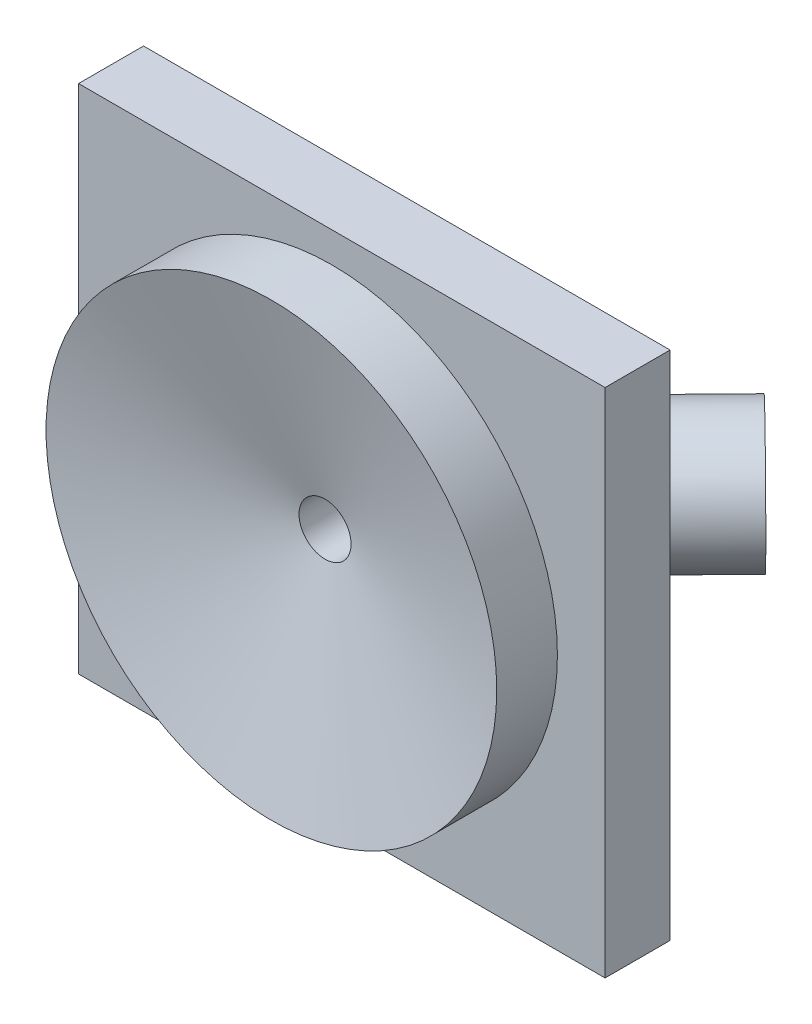
ISO-10303-21;
HEADER;
FILE_DESCRIPTION(('STEP AP214'),'2;1');
FILE_NAME('part.step','',(''),(''),'','','');
FILE_SCHEMA(('AUTOMOTIVE_DESIGN { 1 0 10303 214 1 1 1 1 }'));
ENDSEC;
DATA;
#1=APPLICATION_CONTEXT('core data for automotive mechanical design processes');
#2=APPLICATION_PROTOCOL_DEFINITION('international standard','automotive_design',2000,#1);
#3=PRODUCT_CONTEXT('',#1,'mechanical');
#4=PRODUCT('Part','Part','',(#3));
#5=PRODUCT_RELATED_PRODUCT_CATEGORY('part','',(#4));
#6=PRODUCT_DEFINITION_FORMATION('','',#4);
#7=PRODUCT_DEFINITION_CONTEXT('part definition',#1,'design');
#8=PRODUCT_DEFINITION('design','',#6,#7);
#9=PRODUCT_DEFINITION_SHAPE('','',#8);
#10=(LENGTH_UNIT() NAMED_UNIT(*) SI_UNIT(.MILLI.,.METRE.));
#11=(NAMED_UNIT(*) PLANE_ANGLE_UNIT() SI_UNIT($,.RADIAN.));
#12=(NAMED_UNIT(*) SI_UNIT($,.STERADIAN.) SOLID_ANGLE_UNIT());
#13=UNCERTAINTY_MEASURE_WITH_UNIT(LENGTH_MEASURE(1.E-05),#10,'distance_accuracy_value','');
#14=(GEOMETRIC_REPRESENTATION_CONTEXT(3) GLOBAL_UNCERTAINTY_ASSIGNED_CONTEXT((#13)) GLOBAL_UNIT_ASSIGNED_CONTEXT((#10,
#11,#12)) REPRESENTATION_CONTEXT('',''));
#15=CARTESIAN_POINT('',(0.,0.,0.));
#16=DIRECTION('',(0.,0.,1.));
#17=DIRECTION('',(1.,0.,0.));
#18=AXIS2_PLACEMENT_3D('',#15,#16,#17);
#19=CARTESIAN_POINT('',(27.312795089858,0.,-3.14804184683463));
#20=DIRECTION('',(0.,0.,1.));
#21=DIRECTION('',(1.,0.,0.));
#22=AXIS2_PLACEMENT_3D('',#19,#20,#21);
#23=CONICAL_SURFACE('',#22,0.,1.30780159511398);
#24=CARTESIAN_POINT('',(27.312795089858,0.,-1.74804184683463));
#25=DIRECTION('',(0.,0.,1.));
#26=DIRECTION('',(1.,0.,0.));
#27=AXIS2_PLACEMENT_3D('',#24,#25,#26);
#28=CIRCLE('',#27,5.2);
#29=CARTESIAN_POINT('',(32.512795089858,0.,-1.74804184683463));
#30=VERTEX_POINT('',#29);
#31=EDGE_CURVE('E149',#30,#30,#28,.T.);
#32=CARTESIAN_POINT('',(27.312795089858,0.,-2.98650338529617));
#33=DIRECTION('',(0.,0.,1.));
#34=DIRECTION('',(1.,0.,0.));
#35=AXIS2_PLACEMENT_3D('',#32,#33,#34);
#36=CIRCLE('',#35,0.6);
#37=CARTESIAN_POINT('',(27.912795089858,0.,-2.98650338529617));
#38=VERTEX_POINT('',#37);
#39=EDGE_CURVE('E157',#38,#38,#36,.F.);
#40=CARTESIAN_POINT('',(32.512795089858,0.,-1.74804184683463));
#41=CARTESIAN_POINT('',(32.4648784231913,0.,-1.76094248786027));
#42=CARTESIAN_POINT('',(32.4169617565246,0.,-1.77384312888591));
#43=CARTESIAN_POINT('',(32.3211284231913,0.,-1.7996444109372));
#44=CARTESIAN_POINT('',(32.2732117565246,0.,-1.81254505196284));
#45=CARTESIAN_POINT('',(32.1773784231913,0.,-1.83834633401412));
#46=CARTESIAN_POINT('',(32.1294617565246,0.,-1.85124697503976));
#47=CARTESIAN_POINT('',(32.0336284231913,0.,-1.87704825709104));
#48=CARTESIAN_POINT('',(31.9857117565246,0.,-1.88994889811668));
#49=CARTESIAN_POINT('',(31.8898784231913,0.,-1.91575018016797));
#50=CARTESIAN_POINT('',(31.8419617565246,0.,-1.92865082119361));
#51=CARTESIAN_POINT('',(31.7461284231913,0.,-1.95445210324489));
#52=CARTESIAN_POINT('',(31.6982117565246,0.,-1.96735274427053));
#53=CARTESIAN_POINT('',(31.6023784231913,0.,-1.99315402632181));
#54=CARTESIAN_POINT('',(31.5544617565246,0.,-2.00605466734745));
#55=CARTESIAN_POINT('',(31.4586284231913,0.,-2.03185594939873));
#56=CARTESIAN_POINT('',(31.4107117565246,0.,-2.04475659042438));
#57=CARTESIAN_POINT('',(31.3148784231913,0.,-2.07055787247566));
#58=CARTESIAN_POINT('',(31.2669617565246,0.,-2.0834585135013));
#59=CARTESIAN_POINT('',(31.1711284231913,0.,-2.10925979555258));
#60=CARTESIAN_POINT('',(31.1232117565246,0.,-2.12216043657822));
#61=CARTESIAN_POINT('',(31.0273784231913,0.,-2.1479617186295));
#62=CARTESIAN_POINT('',(30.9794617565246,0.,-2.16086235965515));
#63=CARTESIAN_POINT('',(30.8836284231913,0.,-2.18666364170643));
#64=CARTESIAN_POINT('',(30.8357117565246,0.,-2.19956428273207));
#65=CARTESIAN_POINT('',(30.7398784231913,0.,-2.22536556478335));
#66=CARTESIAN_POINT('',(30.6919617565246,0.,-2.23826620580899));
#67=CARTESIAN_POINT('',(30.5961284231913,0.,-2.26406748786027));
#68=CARTESIAN_POINT('',(30.5482117565246,0.,-2.27696812888591));
#69=CARTESIAN_POINT('',(30.4523784231913,0.,-2.3027694109372));
#70=CARTESIAN_POINT('',(30.4044617565246,0.,-2.31567005196284));
#71=CARTESIAN_POINT('',(30.3086284231913,0.,-2.34147133401412));
#72=CARTESIAN_POINT('',(30.2607117565246,0.,-2.35437197503976));
#73=CARTESIAN_POINT('',(30.1648784231913,0.,-2.38017325709104));
#74=CARTESIAN_POINT('',(30.1169617565246,0.,-2.39307389811668));
#75=CARTESIAN_POINT('',(30.0211284231913,0.,-2.41887518016797));
#76=CARTESIAN_POINT('',(29.9732117565246,0.,-2.43177582119361));
#77=CARTESIAN_POINT('',(29.8773784231913,0.,-2.45757710324489));
#78=CARTESIAN_POINT('',(29.8294617565246,0.,-2.47047774427053));
#79=CARTESIAN_POINT('',(29.7336284231913,0.,-2.49627902632181));
#80=CARTESIAN_POINT('',(29.6857117565246,0.,-2.50917966734745));
#81=CARTESIAN_POINT('',(29.5898784231913,0.,-2.53498094939873));
#82=CARTESIAN_POINT('',(29.5419617565246,0.,-2.54788159042438));
#83=CARTESIAN_POINT('',(29.4461284231913,0.,-2.57368287247566));
#84=CARTESIAN_POINT('',(29.3982117565246,0.,-2.5865835135013));
#85=CARTESIAN_POINT('',(29.3023784231913,0.,-2.61238479555258));
#86=CARTESIAN_POINT('',(29.2544617565246,0.,-2.62528543657822));
#87=CARTESIAN_POINT('',(29.1586284231913,0.,-2.6510867186295));
#88=CARTESIAN_POINT('',(29.1107117565246,0.,-2.66398735965515));
#89=CARTESIAN_POINT('',(29.0148784231913,0.,-2.68978864170643));
#90=CARTESIAN_POINT('',(28.9669617565246,0.,-2.70268928273207));
#91=CARTESIAN_POINT('',(28.8711284231913,0.,-2.72849056478335));
#92=CARTESIAN_POINT('',(28.8232117565246,0.,-2.74139120580899));
#93=CARTESIAN_POINT('',(28.7273784231913,0.,-2.76719248786027));
#94=CARTESIAN_POINT('',(28.6794617565246,0.,-2.78009312888591));
#95=CARTESIAN_POINT('',(28.5836284231913,0.,-2.8058944109372));
#96=CARTESIAN_POINT('',(28.5357117565246,0.,-2.81879505196284));
#97=CARTESIAN_POINT('',(28.4398784231913,0.,-2.84459633401412));
#98=CARTESIAN_POINT('',(28.3919617565246,0.,-2.85749697503976));
#99=CARTESIAN_POINT('',(28.2961284231913,0.,-2.88329825709104));
#100=CARTESIAN_POINT('',(28.2482117565246,0.,-2.89619889811668));
#101=CARTESIAN_POINT('',(28.1523784231913,0.,-2.92200018016797));
#102=CARTESIAN_POINT('',(28.1044617565246,0.,-2.93490082119361));
#103=CARTESIAN_POINT('',(28.0086284231913,0.,-2.96070210324489));
#104=CARTESIAN_POINT('',(27.9607117565246,0.,-2.97360274427053));
#105=CARTESIAN_POINT('',(27.912795089858,0.,-2.98650338529617));
#106=B_SPLINE_CURVE_WITH_KNOTS('',3,(#40,#41,#42,#43,#44,#45,#46,#47,#48,#49,#50,#51,#52,#53,
#54,#55,#56,#57,#58,#59,#60,#61,#62,#63,#64,#65,#66,#67,#68,#69,#70,#71,#72,#73,#74,#75,#76,#77,
#78,#79,#80,#81,#82,#83,#84,#85,#86,#87,#88,#89,#90,#91,#92,#93,#94,#95,#96,#97,#98,#99,#100,
#101,#102,#103,#104,#105),.UNSPECIFIED.,.F.,.F.,(4,2,2,2,2,2,2,2,2,2,2,2,2,2,2,2,2,2,2,2,2,2,2,
2,2,2,2,2,2,2,2,2,4),(0.,0.148868738658764,0.297737477317529,0.4466062159763,0.595474954635065,
0.744343693293829,0.893212431952593,1.04208117061136,1.19094990927013,1.3398186479289,
1.48868738658766,1.63755612524643,1.78642486390519,1.93529360256396,2.08416234122273,
2.23303107988149,2.38189981854026,2.53076855719903,2.67963729585779,2.82850603451656,
2.97737477317533,3.12624351183409,3.27511225049286,3.42398098915163,3.57284972781039,
3.72171846646916,3.87058720512792,4.01945594378669,4.16832468244546,4.31719342110422,
4.46606215976299,4.61493089842176,4.76379963708052),.UNSPECIFIED.);
#107=EDGE_CURVE('BSEAM39',#30,#38,#106,.T.);
#108=ORIENTED_EDGE('',*,*,#31,.T.);
#109=ORIENTED_EDGE('',*,*,#39,.T.);
#110=ORIENTED_EDGE('',*,*,#107,.T.);
#111=ORIENTED_EDGE('',*,*,#107,.F.);
#112=EDGE_LOOP('',(#108,#110,#109,#111));
#113=FACE_BOUND('',#112,.T.);
#114=ADVANCED_FACE('F39',(#113),#23,.F.);
#115=CARTESIAN_POINT('',(27.312795089858,0.,-4.64804184683463));
#116=DIRECTION('',(0.,0.,-1.));
#117=DIRECTION('',(-1.,0.,0.));
#118=AXIS2_PLACEMENT_3D('',#115,#116,#117);
#119=PLANE('',#118);
#120=CARTESIAN_POINT('',(27.2730304625921,0.,-4.64804184683463));
#121=DIRECTION('',(0.,0.,-1.));
#122=DIRECTION('',(-1.,0.,0.));
#123=AXIS2_PLACEMENT_3D('',#120,#121,#122);
#124=ELLIPSE('',#123,2.06152825217142,1.475);
#125=CARTESIAN_POINT('',(27.412795089858,-1.47160626527615,-4.64804184683463));
#126=VERTEX_POINT('',#125);
#127=CARTESIAN_POINT('',(27.412795089858,1.47160626527615,-4.64804184683463));
#128=VERTEX_POINT('',#127);
#129=EDGE_CURVE('E49',#126,#128,#124,.F.);
#130=ORIENTED_EDGE('',*,*,#129,.T.);
#131=CARTESIAN_POINT('',(27.312795089858,0.,-4.64804184683463));
#132=DIRECTION('',(0.,0.,-1.));
#133=DIRECTION('',(-1.,0.,0.));
#134=AXIS2_PLACEMENT_3D('',#131,#132,#133);
#135=CIRCLE('',#134,1.475);
#136=EDGE_CURVE('E11',#128,#126,#135,.F.);
#137=ORIENTED_EDGE('',*,*,#136,.T.);
#138=EDGE_LOOP('',(#130,#137));
#139=FACE_BOUND('',#138,.T.);
#140=DIRECTION('',(0.,1.,0.));
#141=VECTOR('',#140,1.);
#142=CARTESIAN_POINT('',(21.462795089858,-5.9,-4.64804184683463));
#143=LINE('',#142,#141);
#144=CARTESIAN_POINT('',(21.462795089858,-5.9,-4.64804184683463));
#145=VERTEX_POINT('',#144);
#146=CARTESIAN_POINT('',(21.462795089858,5.9,-4.64804184683463));
#147=VERTEX_POINT('',#146);
#148=EDGE_CURVE('E127',#145,#147,#143,.T.);
#149=ORIENTED_EDGE('',*,*,#148,.T.);
#150=DIRECTION('',(1.,0.,0.));
#151=VECTOR('',#150,1.);
#152=CARTESIAN_POINT('',(21.462795089858,5.9,-4.64804184683463));
#153=LINE('',#152,#151);
#154=CARTESIAN_POINT('',(33.612795089858,5.9,-4.64804184683463));
#155=VERTEX_POINT('',#154);
#156=EDGE_CURVE('E91',#147,#155,#153,.T.);
#157=ORIENTED_EDGE('',*,*,#156,.T.);
#158=DIRECTION('',(0.,-1.,0.));
#159=VECTOR('',#158,1.);
#160=CARTESIAN_POINT('',(33.612795089858,5.9,-4.64804184683463));
#161=LINE('',#160,#159);
#162=CARTESIAN_POINT('',(33.612795089858,-5.9,-4.64804184683463));
#163=VERTEX_POINT('',#162);
#164=EDGE_CURVE('E118',#155,#163,#161,.T.);
#165=ORIENTED_EDGE('',*,*,#164,.T.);
#166=DIRECTION('',(-1.,0.,0.));
#167=VECTOR('',#166,1.);
#168=CARTESIAN_POINT('',(33.612795089858,-5.9,-4.64804184683463));
#169=LINE('',#168,#167);
#170=EDGE_CURVE('E114',#163,#145,#169,.T.);
#171=ORIENTED_EDGE('',*,*,#170,.T.);
#172=EDGE_LOOP('',(#149,#157,#165,#171));
#173=FACE_BOUND('',#172,.T.);
#174=ADVANCED_FACE('F41',(#139,#173),#119,.T.);
#175=CARTESIAN_POINT('',(31.4838869151828,0.,-8.96054497290303));
#176=DIRECTION('',(0.698624389490976,0.,-0.715488617944661));
#177=DIRECTION('',(-0.715488617944661,0.,-0.698624389490976));
#178=AXIS2_PLACEMENT_3D('',#175,#176,#177);
#179=PLANE('',#178);
#180=CARTESIAN_POINT('',(31.5344781103892,0.,-8.9111462236032));
#181=DIRECTION('',(0.698624389490976,0.,-0.715488617944661));
#182=DIRECTION('',(0.715488617944661,0.,0.698624389490976));
#183=AXIS2_PLACEMENT_3D('',#180,#181,#182);
#184=ELLIPSE('',#183,0.6000426648805,0.6);
#185=CARTESIAN_POINT('',(31.9638018073924,0.,-8.49194178318252));
#186=VERTEX_POINT('',#185);
#187=EDGE_CURVE('E43',#186,#186,#184,.F.);
#188=ORIENTED_EDGE('',*,*,#187,.T.);
#189=EDGE_LOOP('',(#188));
#190=FACE_BOUND('',#189,.T.);
#191=CARTESIAN_POINT('',(31.4838869151828,0.,-8.96054497290303));
#192=DIRECTION('',(0.698624389490976,0.,-0.715488617944661));
#193=DIRECTION('',(-0.715488617944661,0.,-0.698624389490976));
#194=AXIS2_PLACEMENT_3D('',#191,#192,#193);
#195=CIRCLE('',#194,1.475);
#196=CARTESIAN_POINT('',(30.4285412037144,0.,-9.99101594740222));
#197=VERTEX_POINT('',#196);
#198=EDGE_CURVE('E143',#197,#197,#195,.T.);
#199=ORIENTED_EDGE('',*,*,#198,.T.);
#200=EDGE_LOOP('',(#199));
#201=FACE_BOUND('',#200,.T.);
#202=ADVANCED_FACE('F190',(#190,#201),#179,.T.);
#203=CARTESIAN_POINT('',(27.312795089858,0.,-5.45359403886449));
#204=DIRECTION('',(0.,0.,1.));
#205=DIRECTION('',(1.,0.,0.));
#206=AXIS2_PLACEMENT_3D('',#203,#204,#205);
#207=CYLINDRICAL_SURFACE('',#206,1.475);
#208=ORIENTED_EDGE('',*,*,#136,.F.);
#209=CARTESIAN_POINT('',(27.312795089858,0.,-4.68876636008311));
#210=DIRECTION('',(-0.377167987808708,0.,0.926144863923744));
#211=DIRECTION('',(-0.926144863923744,0.,-0.377167987808708));
#212=AXIS2_PLACEMENT_3D('',#209,#210,#211);
#213=ELLIPSE('',#212,1.59262341935467,1.475);
#214=EDGE_CURVE('E56',#128,#126,#213,.T.);
#215=ORIENTED_EDGE('',*,*,#214,.T.);
#216=EDGE_LOOP('',(#208,#215));
#217=FACE_BOUND('',#216,.T.);
#218=ADVANCED_FACE('F196',(#217),#207,.T.);
#219=CARTESIAN_POINT('',(31.4838869151828,0.,-8.96054497290303));
#220=DIRECTION('',(-0.698624389490976,0.,0.715488617944661));
#221=DIRECTION('',(0.715488617944661,0.,0.698624389490976));
#222=AXIS2_PLACEMENT_3D('',#219,#220,#221);
#223=CYLINDRICAL_SURFACE('',#222,1.475);
#224=ORIENTED_EDGE('',*,*,#129,.F.);
#225=ORIENTED_EDGE('',*,*,#214,.F.);
#226=EDGE_LOOP('',(#224,#225));
#227=FACE_BOUND('',#226,.T.);
#228=ORIENTED_EDGE('',*,*,#198,.F.);
#229=EDGE_LOOP('',(#228));
#230=FACE_BOUND('',#229,.T.);
#231=ADVANCED_FACE('F192',(#227,#230),#223,.T.);
#232=CARTESIAN_POINT('',(21.462795089858,-5.9,-3.14804184683463));
#233=DIRECTION('',(-1.,0.,0.));
#234=DIRECTION('',(0.,0.,1.));
#235=AXIS2_PLACEMENT_3D('',#232,#233,#234);
#236=PLANE('',#235);
#237=ORIENTED_EDGE('',*,*,#148,.F.);
#238=DIRECTION('',(0.,0.,-1.));
#239=VECTOR('',#238,1.);
#240=CARTESIAN_POINT('',(21.462795089858,-5.9,-3.14804184683463));
#241=LINE('',#240,#239);
#242=CARTESIAN_POINT('',(21.462795089858,-5.9,-3.14804184683463));
#243=VERTEX_POINT('',#242);
#244=EDGE_CURVE('E112',#243,#145,#241,.T.);
#245=ORIENTED_EDGE('',*,*,#244,.F.);
#246=DIRECTION('',(0.,1.,0.));
#247=VECTOR('',#246,1.);
#248=CARTESIAN_POINT('',(21.462795089858,-5.9,-3.14804184683463));
#249=LINE('',#248,#247);
#250=CARTESIAN_POINT('',(21.462795089858,5.9,-3.14804184683463));
#251=VERTEX_POINT('',#250);
#252=EDGE_CURVE('E105',#243,#251,#249,.T.);
#253=ORIENTED_EDGE('',*,*,#252,.T.);
#254=DIRECTION('',(0.,0.,-1.));
#255=VECTOR('',#254,1.);
#256=CARTESIAN_POINT('',(21.462795089858,5.9,-3.14804184683463));
#257=LINE('',#256,#255);
#258=EDGE_CURVE('E86',#251,#147,#257,.T.);
#259=ORIENTED_EDGE('',*,*,#258,.T.);
#260=EDGE_LOOP('',(#237,#245,#253,#259));
#261=FACE_BOUND('',#260,.T.);
#262=ADVANCED_FACE('F111',(#261),#236,.T.);
#263=CARTESIAN_POINT('',(33.612795089858,-5.9,-3.14804184683463));
#264=DIRECTION('',(0.,-1.,0.));
#265=DIRECTION('',(0.,0.,-1.));
#266=AXIS2_PLACEMENT_3D('',#263,#264,#265);
#267=PLANE('',#266);
#268=ORIENTED_EDGE('',*,*,#170,.F.);
#269=DIRECTION('',(0.,0.,-1.));
#270=VECTOR('',#269,1.);
#271=CARTESIAN_POINT('',(33.612795089858,-5.9,-3.14804184683463));
#272=LINE('',#271,#270);
#273=CARTESIAN_POINT('',(33.612795089858,-5.9,-3.14804184683463));
#274=VERTEX_POINT('',#273);
#275=EDGE_CURVE('E138',#274,#163,#272,.T.);
#276=ORIENTED_EDGE('',*,*,#275,.F.);
#277=DIRECTION('',(-1.,0.,0.));
#278=VECTOR('',#277,1.);
#279=CARTESIAN_POINT('',(33.612795089858,-5.9,-3.14804184683463));
#280=LINE('',#279,#278);
#281=EDGE_CURVE('E98',#274,#243,#280,.T.);
#282=ORIENTED_EDGE('',*,*,#281,.T.);
#283=ORIENTED_EDGE('',*,*,#244,.T.);
#284=EDGE_LOOP('',(#268,#276,#282,#283));
#285=FACE_BOUND('',#284,.T.);
#286=ADVANCED_FACE('F205',(#285),#267,.T.);
#287=CARTESIAN_POINT('',(33.612795089858,5.9,-3.14804184683463));
#288=DIRECTION('',(1.,0.,0.));
#289=DIRECTION('',(0.,0.,-1.));
#290=AXIS2_PLACEMENT_3D('',#287,#288,#289);
#291=PLANE('',#290);
#292=ORIENTED_EDGE('',*,*,#164,.F.);
#293=DIRECTION('',(0.,0.,-1.));
#294=VECTOR('',#293,1.);
#295=CARTESIAN_POINT('',(33.612795089858,5.9,-3.14804184683463));
#296=LINE('',#295,#294);
#297=CARTESIAN_POINT('',(33.612795089858,5.9,-3.14804184683463));
#298=VERTEX_POINT('',#297);
#299=EDGE_CURVE('E97',#298,#155,#296,.T.);
#300=ORIENTED_EDGE('',*,*,#299,.F.);
#301=DIRECTION('',(0.,-1.,0.));
#302=VECTOR('',#301,1.);
#303=CARTESIAN_POINT('',(33.612795089858,5.9,-3.14804184683463));
#304=LINE('',#303,#302);
#305=EDGE_CURVE('E108',#298,#274,#304,.T.);
#306=ORIENTED_EDGE('',*,*,#305,.T.);
#307=ORIENTED_EDGE('',*,*,#275,.T.);
#308=EDGE_LOOP('',(#292,#300,#306,#307));
#309=FACE_BOUND('',#308,.T.);
#310=ADVANCED_FACE('F208',(#309),#291,.T.);
#311=CARTESIAN_POINT('',(21.462795089858,5.9,-3.14804184683463));
#312=DIRECTION('',(0.,1.,0.));
#313=DIRECTION('',(-1.,0.,0.));
#314=AXIS2_PLACEMENT_3D('',#311,#312,#313);
#315=PLANE('',#314);
#316=ORIENTED_EDGE('',*,*,#156,.F.);
#317=ORIENTED_EDGE('',*,*,#258,.F.);
#318=DIRECTION('',(1.,0.,0.));
#319=VECTOR('',#318,1.);
#320=CARTESIAN_POINT('',(21.462795089858,5.9,-3.14804184683463));
#321=LINE('',#320,#319);
#322=EDGE_CURVE('E89',#251,#298,#321,.T.);
#323=ORIENTED_EDGE('',*,*,#322,.T.);
#324=ORIENTED_EDGE('',*,*,#299,.T.);
#325=EDGE_LOOP('',(#316,#317,#323,#324));
#326=FACE_BOUND('',#325,.T.);
#327=ADVANCED_FACE('F88',(#326),#315,.T.);
#328=CARTESIAN_POINT('',(0.,0.,-3.14804184683463));
#329=DIRECTION('',(0.,0.,-1.));
#330=DIRECTION('',(-1.,0.,0.));
#331=AXIS2_PLACEMENT_3D('',#328,#329,#330);
#332=PLANE('',#331);
#333=CARTESIAN_POINT('',(27.312795089858,0.,-3.14804184683463));
#334=DIRECTION('',(0.,0.,-1.));
#335=DIRECTION('',(-1.,0.,0.));
#336=AXIS2_PLACEMENT_3D('',#333,#334,#335);
#337=CIRCLE('',#336,5.2);
#338=CARTESIAN_POINT('',(22.112795089858,0.,-3.14804184683463));
#339=VERTEX_POINT('',#338);
#340=EDGE_CURVE('E137',#339,#339,#337,.F.);
#341=ORIENTED_EDGE('',*,*,#340,.F.);
#342=EDGE_LOOP('',(#341));
#343=FACE_BOUND('',#342,.T.);
#344=ORIENTED_EDGE('',*,*,#252,.F.);
#345=ORIENTED_EDGE('',*,*,#281,.F.);
#346=ORIENTED_EDGE('',*,*,#305,.F.);
#347=ORIENTED_EDGE('',*,*,#322,.F.);
#348=EDGE_LOOP('',(#344,#345,#346,#347));
#349=FACE_BOUND('',#348,.T.);
#350=ADVANCED_FACE('F103',(#343,#349),#332,.F.);
#351=CARTESIAN_POINT('',(27.312795089858,0.,-3.14804184683463));
#352=DIRECTION('',(0.,0.,1.));
#353=DIRECTION('',(1.,0.,0.));
#354=AXIS2_PLACEMENT_3D('',#351,#352,#353);
#355=CYLINDRICAL_SURFACE('',#354,5.2);
#356=ORIENTED_EDGE('',*,*,#31,.F.);
#357=EDGE_LOOP('',(#356));
#358=FACE_BOUND('',#357,.T.);
#359=ORIENTED_EDGE('',*,*,#340,.T.);
#360=EDGE_LOOP('',(#359));
#361=FACE_BOUND('',#360,.T.);
#362=ADVANCED_FACE('F172',(#358,#361),#355,.T.);
#363=CARTESIAN_POINT('',(27.0458459551343,0.,-4.42251406834827));
#364=DIRECTION('',(0.707106781186549,0.,-0.707106781186546));
#365=DIRECTION('',(-0.707106781186546,0.,-0.707106781186549));
#366=AXIS2_PLACEMENT_3D('',#363,#364,#365);
#367=CYLINDRICAL_SURFACE('',#366,0.6);
#368=ORIENTED_EDGE('',*,*,#187,.F.);
#369=EDGE_LOOP('',(#368));
#370=FACE_BOUND('',#369,.T.);
#371=CARTESIAN_POINT('',(27.312795089858,0.,-4.68946320307194));
#372=DIRECTION('',(0.382683432365091,0.,-0.923879532511287));
#373=DIRECTION('',(-0.923879532511287,0.,-0.382683432365091));
#374=AXIS2_PLACEMENT_3D('',#371,#372,#373);
#375=ELLIPSE('',#374,0.649435320175437,0.6);
#376=CARTESIAN_POINT('',(26.712795089858,0.,-4.9379913404958));
#377=VERTEX_POINT('',#376);
#378=EDGE_CURVE('E121',#377,#377,#375,.T.);
#379=ORIENTED_EDGE('',*,*,#378,.F.);
#380=EDGE_LOOP('',(#379));
#381=FACE_BOUND('',#380,.T.);
#382=ADVANCED_FACE('F170',(#370,#381),#367,.F.);
#383=CARTESIAN_POINT('',(27.312795089858,0.,0.));
#384=DIRECTION('',(0.,0.,-1.));
#385=DIRECTION('',(-1.,0.,0.));
#386=AXIS2_PLACEMENT_3D('',#383,#384,#385);
#387=CYLINDRICAL_SURFACE('',#386,0.6);
#388=ORIENTED_EDGE('',*,*,#39,.F.);
#389=EDGE_LOOP('',(#388));
#390=FACE_BOUND('',#389,.T.);
#391=ORIENTED_EDGE('',*,*,#378,.T.);
#392=EDGE_LOOP('',(#391));
#393=FACE_BOUND('',#392,.T.);
#394=ADVANCED_FACE('F168',(#390,#393),#387,.F.);
#395=CLOSED_SHELL('',(#114,#174,#202,#218,#231,#262,#286,#310,#327,#350,#362,#382,#394));
#396=MANIFOLD_SOLID_BREP('B2',#395);
#397=ADVANCED_BREP_SHAPE_REPRESENTATION('',(#18,#396),#14);
#398=SHAPE_DEFINITION_REPRESENTATION(#9,#397);
ENDSEC;
END-ISO-10303-21;
